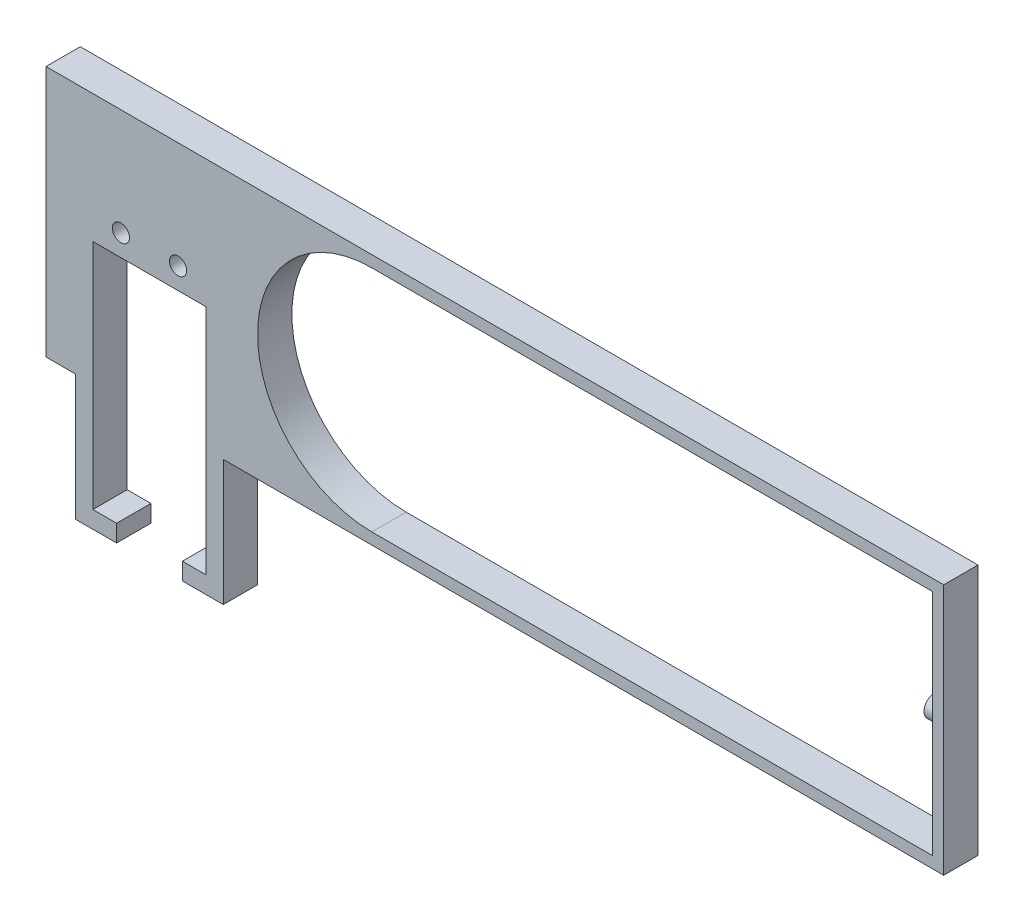
ISO-10303-21;
HEADER;
FILE_DESCRIPTION(('STEP AP214'),'2;1');
FILE_NAME('part.step','',(''),(''),'','','');
FILE_SCHEMA(('AUTOMOTIVE_DESIGN { 1 0 10303 214 1 1 1 1 }'));
ENDSEC;
DATA;
#1=APPLICATION_CONTEXT('core data for automotive mechanical design processes');
#2=APPLICATION_PROTOCOL_DEFINITION('international standard','automotive_design',2000,#1);
#3=PRODUCT_CONTEXT('',#1,'mechanical');
#4=PRODUCT('Part','Part','',(#3));
#5=PRODUCT_RELATED_PRODUCT_CATEGORY('part','',(#4));
#6=PRODUCT_DEFINITION_FORMATION('','',#4);
#7=PRODUCT_DEFINITION_CONTEXT('part definition',#1,'design');
#8=PRODUCT_DEFINITION('design','',#6,#7);
#9=PRODUCT_DEFINITION_SHAPE('','',#8);
#10=(LENGTH_UNIT() NAMED_UNIT(*) SI_UNIT(.MILLI.,.METRE.));
#11=(NAMED_UNIT(*) PLANE_ANGLE_UNIT() SI_UNIT($,.RADIAN.));
#12=(NAMED_UNIT(*) SI_UNIT($,.STERADIAN.) SOLID_ANGLE_UNIT());
#13=UNCERTAINTY_MEASURE_WITH_UNIT(LENGTH_MEASURE(1.E-05),#10,'distance_accuracy_value','');
#14=(GEOMETRIC_REPRESENTATION_CONTEXT(3) GLOBAL_UNCERTAINTY_ASSIGNED_CONTEXT((#13)) GLOBAL_UNIT_ASSIGNED_CONTEXT((#10,
#11,#12)) REPRESENTATION_CONTEXT('',''));
#15=CARTESIAN_POINT('',(0.,0.,0.));
#16=DIRECTION('',(0.,0.,1.));
#17=DIRECTION('',(1.,0.,0.));
#18=AXIS2_PLACEMENT_3D('',#15,#16,#17);
#19=CARTESIAN_POINT('',(0.,0.,6.));
#20=DIRECTION('',(0.,0.,1.));
#21=DIRECTION('',(1.,0.,0.));
#22=AXIS2_PLACEMENT_3D('',#19,#20,#21);
#23=PLANE('',#22);
#24=CARTESIAN_POINT('',(-43.9,25.353,6.));
#25=DIRECTION('',(0.,0.,1.));
#26=DIRECTION('',(1.,0.,0.));
#27=AXIS2_PLACEMENT_3D('',#24,#25,#26);
#28=CIRCLE('',#27,1.5);
#29=CARTESIAN_POINT('',(-42.4,25.353,6.));
#30=VERTEX_POINT('',#29);
#31=EDGE_CURVE('E215',#30,#30,#28,.T.);
#32=ORIENTED_EDGE('',*,*,#31,.F.);
#33=EDGE_LOOP('',(#32));
#34=FACE_BOUND('',#33,.T.);
#35=DIRECTION('',(1.,0.,0.));
#36=VECTOR('',#35,1.);
#37=CARTESIAN_POINT('',(0.,0.,6.));
#38=LINE('',#37,#36);
#39=CARTESIAN_POINT('',(-26.,0.,6.));
#40=VERTEX_POINT('',#39);
#41=CARTESIAN_POINT('',(100.,0.,6.));
#42=VERTEX_POINT('',#41);
#43=EDGE_CURVE('E221',#40,#42,#38,.T.);
#44=ORIENTED_EDGE('',*,*,#43,.T.);
#45=DIRECTION('',(0.,1.,0.));
#46=VECTOR('',#45,1.);
#47=CARTESIAN_POINT('',(100.,0.,6.));
#48=LINE('',#47,#46);
#49=CARTESIAN_POINT('',(100.,44.,6.));
#50=VERTEX_POINT('',#49);
#51=EDGE_CURVE('E223',#42,#50,#48,.T.);
#52=ORIENTED_EDGE('',*,*,#51,.T.);
#53=DIRECTION('',(-1.,0.,0.));
#54=VECTOR('',#53,1.);
#55=CARTESIAN_POINT('',(100.,44.,6.));
#56=LINE('',#55,#54);
#57=CARTESIAN_POINT('',(-57.,44.,6.));
#58=VERTEX_POINT('',#57);
#59=EDGE_CURVE('E226',#50,#58,#56,.T.);
#60=ORIENTED_EDGE('',*,*,#59,.T.);
#61=DIRECTION('',(0.,-1.,0.));
#62=VECTOR('',#61,1.);
#63=CARTESIAN_POINT('',(-57.,44.,6.));
#64=LINE('',#63,#62);
#65=CARTESIAN_POINT('',(-57.,0.,6.));
#66=VERTEX_POINT('',#65);
#67=EDGE_CURVE('E228',#58,#66,#64,.T.);
#68=ORIENTED_EDGE('',*,*,#67,.T.);
#69=DIRECTION('',(1.,0.,0.));
#70=VECTOR('',#69,1.);
#71=CARTESIAN_POINT('',(-57.,0.,6.));
#72=LINE('',#71,#70);
#73=CARTESIAN_POINT('',(-51.8,0.,6.));
#74=VERTEX_POINT('',#73);
#75=EDGE_CURVE('E230',#66,#74,#72,.T.);
#76=ORIENTED_EDGE('',*,*,#75,.T.);
#77=DIRECTION('',(0.,-1.,0.));
#78=VECTOR('',#77,1.);
#79=CARTESIAN_POINT('',(-51.8,0.,6.));
#80=LINE('',#79,#78);
#81=CARTESIAN_POINT('',(-51.8,-22.,6.));
#82=VERTEX_POINT('',#81);
#83=EDGE_CURVE('E232',#74,#82,#80,.T.);
#84=ORIENTED_EDGE('',*,*,#83,.T.);
#85=DIRECTION('',(1.,0.,0.));
#86=VECTOR('',#85,1.);
#87=CARTESIAN_POINT('',(-51.8,-22.,6.));
#88=LINE('',#87,#86);
#89=CARTESIAN_POINT('',(-44.65,-22.,6.));
#90=VERTEX_POINT('',#89);
#91=EDGE_CURVE('E234',#82,#90,#88,.T.);
#92=ORIENTED_EDGE('',*,*,#91,.T.);
#93=DIRECTION('',(0.,1.,0.));
#94=VECTOR('',#93,1.);
#95=CARTESIAN_POINT('',(-44.65,-22.,6.));
#96=LINE('',#95,#94);
#97=CARTESIAN_POINT('',(-44.65,-19.,6.));
#98=VERTEX_POINT('',#97);
#99=EDGE_CURVE('E236',#90,#98,#96,.T.);
#100=ORIENTED_EDGE('',*,*,#99,.T.);
#101=DIRECTION('',(-1.,0.,0.));
#102=VECTOR('',#101,1.);
#103=CARTESIAN_POINT('',(-44.65,-19.,6.));
#104=LINE('',#103,#102);
#105=CARTESIAN_POINT('',(-48.8,-19.,6.));
#106=VERTEX_POINT('',#105);
#107=EDGE_CURVE('E238',#98,#106,#104,.T.);
#108=ORIENTED_EDGE('',*,*,#107,.T.);
#109=DIRECTION('',(0.,1.,0.));
#110=VECTOR('',#109,1.);
#111=CARTESIAN_POINT('',(-48.8,-19.,6.));
#112=LINE('',#111,#110);
#113=CARTESIAN_POINT('',(-48.8,21.6,6.));
#114=VERTEX_POINT('',#113);
#115=EDGE_CURVE('E240',#106,#114,#112,.T.);
#116=ORIENTED_EDGE('',*,*,#115,.T.);
#117=DIRECTION('',(1.,0.,0.));
#118=VECTOR('',#117,1.);
#119=CARTESIAN_POINT('',(-48.8,21.6,6.));
#120=LINE('',#119,#118);
#121=CARTESIAN_POINT('',(-29.,21.6,6.));
#122=VERTEX_POINT('',#121);
#123=EDGE_CURVE('E242',#114,#122,#120,.T.);
#124=ORIENTED_EDGE('',*,*,#123,.T.);
#125=DIRECTION('',(0.,-1.,0.));
#126=VECTOR('',#125,1.);
#127=CARTESIAN_POINT('',(-29.,21.6,6.));
#128=LINE('',#127,#126);
#129=CARTESIAN_POINT('',(-29.,-19.,6.));
#130=VERTEX_POINT('',#129);
#131=EDGE_CURVE('E244',#122,#130,#128,.T.);
#132=ORIENTED_EDGE('',*,*,#131,.T.);
#133=DIRECTION('',(-1.,0.,0.));
#134=VECTOR('',#133,1.);
#135=CARTESIAN_POINT('',(-29.,-19.,6.));
#136=LINE('',#135,#134);
#137=CARTESIAN_POINT('',(-33.15,-19.,6.));
#138=VERTEX_POINT('',#137);
#139=EDGE_CURVE('E246',#130,#138,#136,.T.);
#140=ORIENTED_EDGE('',*,*,#139,.T.);
#141=DIRECTION('',(0.,-1.,0.));
#142=VECTOR('',#141,1.);
#143=CARTESIAN_POINT('',(-33.15,-19.,6.));
#144=LINE('',#143,#142);
#145=CARTESIAN_POINT('',(-33.15,-22.,6.));
#146=VERTEX_POINT('',#145);
#147=EDGE_CURVE('E248',#138,#146,#144,.T.);
#148=ORIENTED_EDGE('',*,*,#147,.T.);
#149=DIRECTION('',(1.,0.,0.));
#150=VECTOR('',#149,1.);
#151=CARTESIAN_POINT('',(-33.15,-22.,6.));
#152=LINE('',#151,#150);
#153=CARTESIAN_POINT('',(-26.,-22.,6.));
#154=VERTEX_POINT('',#153);
#155=EDGE_CURVE('E250',#146,#154,#152,.T.);
#156=ORIENTED_EDGE('',*,*,#155,.T.);
#157=DIRECTION('',(0.,1.,0.));
#158=VECTOR('',#157,1.);
#159=CARTESIAN_POINT('',(-26.,0.,6.));
#160=LINE('',#159,#158);
#161=EDGE_CURVE('E252',#154,#40,#160,.T.);
#162=ORIENTED_EDGE('',*,*,#161,.T.);
#163=EDGE_LOOP('',(#44,#52,#60,#68,#76,#84,#92,#100,#108,#116,#124,#132,#140,#148,#156,#162));
#164=FACE_BOUND('',#163,.T.);
#165=CARTESIAN_POINT('',(-33.9,25.353,6.));
#166=DIRECTION('',(0.,0.,1.));
#167=DIRECTION('',(1.,0.,0.));
#168=AXIS2_PLACEMENT_3D('',#165,#166,#167);
#169=CIRCLE('',#168,1.5);
#170=CARTESIAN_POINT('',(-32.4,25.353,6.));
#171=VERTEX_POINT('',#170);
#172=EDGE_CURVE('E209',#171,#171,#169,.T.);
#173=ORIENTED_EDGE('',*,*,#172,.F.);
#174=EDGE_LOOP('',(#173));
#175=FACE_BOUND('',#174,.T.);
#176=DIRECTION('',(1.,0.,0.));
#177=VECTOR('',#176,1.);
#178=CARTESIAN_POINT('',(0.,2.,6.));
#179=LINE('',#178,#177);
#180=CARTESIAN_POINT('',(0.,2.,6.));
#181=VERTEX_POINT('',#180);
#182=CARTESIAN_POINT('',(98.,2.00000000000001,6.));
#183=VERTEX_POINT('',#182);
#184=EDGE_CURVE('E179',#181,#183,#179,.T.);
#185=ORIENTED_EDGE('',*,*,#184,.F.);
#186=CARTESIAN_POINT('',(0.,22.,6.));
#187=DIRECTION('',(0.,0.,1.));
#188=DIRECTION('',(1.,0.,0.));
#189=AXIS2_PLACEMENT_3D('',#186,#187,#188);
#190=CIRCLE('',#189,20.);
#191=CARTESIAN_POINT('',(0.,42.,6.));
#192=VERTEX_POINT('',#191);
#193=EDGE_CURVE('E171',#192,#181,#190,.T.);
#194=ORIENTED_EDGE('',*,*,#193,.F.);
#195=DIRECTION('',(-1.,0.,0.));
#196=VECTOR('',#195,1.);
#197=CARTESIAN_POINT('',(98.,42.,6.));
#198=LINE('',#197,#196);
#199=CARTESIAN_POINT('',(98.,42.,6.));
#200=VERTEX_POINT('',#199);
#201=EDGE_CURVE('E193',#200,#192,#198,.T.);
#202=ORIENTED_EDGE('',*,*,#201,.F.);
#203=DIRECTION('',(0.,1.,0.));
#204=VECTOR('',#203,1.);
#205=CARTESIAN_POINT('',(98.,2.00000000000001,6.));
#206=LINE('',#205,#204);
#207=EDGE_CURVE('E191',#183,#200,#206,.T.);
#208=ORIENTED_EDGE('',*,*,#207,.F.);
#209=EDGE_LOOP('',(#185,#194,#202,#208));
#210=FACE_BOUND('',#209,.T.);
#211=ADVANCED_FACE('F34',(#34,#164,#175,#210),#23,.T.);
#212=CARTESIAN_POINT('',(0.,0.,0.));
#213=DIRECTION('',(0.,0.,1.));
#214=DIRECTION('',(1.,0.,0.));
#215=AXIS2_PLACEMENT_3D('',#212,#213,#214);
#216=PLANE('',#215);
#217=CARTESIAN_POINT('',(-33.9,25.353,0.));
#218=DIRECTION('',(0.,0.,1.));
#219=DIRECTION('',(1.,0.,0.));
#220=AXIS2_PLACEMENT_3D('',#217,#218,#219);
#221=CIRCLE('',#220,1.5);
#222=CARTESIAN_POINT('',(-32.4,25.353,0.));
#223=VERTEX_POINT('',#222);
#224=EDGE_CURVE('E187',#223,#223,#221,.T.);
#225=ORIENTED_EDGE('',*,*,#224,.T.);
#226=EDGE_LOOP('',(#225));
#227=FACE_BOUND('',#226,.T.);
#228=CARTESIAN_POINT('',(-43.9,25.353,0.));
#229=DIRECTION('',(0.,0.,1.));
#230=DIRECTION('',(1.,0.,0.));
#231=AXIS2_PLACEMENT_3D('',#228,#229,#230);
#232=CIRCLE('',#231,1.5);
#233=CARTESIAN_POINT('',(-42.4,25.353,0.));
#234=VERTEX_POINT('',#233);
#235=EDGE_CURVE('E212',#234,#234,#232,.T.);
#236=ORIENTED_EDGE('',*,*,#235,.T.);
#237=EDGE_LOOP('',(#236));
#238=FACE_BOUND('',#237,.T.);
#239=DIRECTION('',(1.,0.,0.));
#240=VECTOR('',#239,1.);
#241=CARTESIAN_POINT('',(0.,0.,0.));
#242=LINE('',#241,#240);
#243=CARTESIAN_POINT('',(-26.,0.,0.));
#244=VERTEX_POINT('',#243);
#245=CARTESIAN_POINT('',(100.,0.,0.));
#246=VERTEX_POINT('',#245);
#247=EDGE_CURVE('E218',#244,#246,#242,.T.);
#248=ORIENTED_EDGE('',*,*,#247,.F.);
#249=DIRECTION('',(0.,1.,0.));
#250=VECTOR('',#249,1.);
#251=CARTESIAN_POINT('',(-26.,0.,0.));
#252=LINE('',#251,#250);
#253=CARTESIAN_POINT('',(-26.,-22.,0.));
#254=VERTEX_POINT('',#253);
#255=EDGE_CURVE('E224',#254,#244,#252,.T.);
#256=ORIENTED_EDGE('',*,*,#255,.F.);
#257=DIRECTION('',(1.,0.,0.));
#258=VECTOR('',#257,1.);
#259=CARTESIAN_POINT('',(-33.15,-22.,0.));
#260=LINE('',#259,#258);
#261=CARTESIAN_POINT('',(-33.15,-22.,0.));
#262=VERTEX_POINT('',#261);
#263=EDGE_CURVE('E283',#262,#254,#260,.T.);
#264=ORIENTED_EDGE('',*,*,#263,.F.);
#265=DIRECTION('',(0.,-1.,0.));
#266=VECTOR('',#265,1.);
#267=CARTESIAN_POINT('',(-33.15,-19.,0.));
#268=LINE('',#267,#266);
#269=CARTESIAN_POINT('',(-33.15,-19.,0.));
#270=VERTEX_POINT('',#269);
#271=EDGE_CURVE('E281',#270,#262,#268,.T.);
#272=ORIENTED_EDGE('',*,*,#271,.F.);
#273=DIRECTION('',(-1.,0.,0.));
#274=VECTOR('',#273,1.);
#275=CARTESIAN_POINT('',(-29.,-19.,0.));
#276=LINE('',#275,#274);
#277=CARTESIAN_POINT('',(-29.,-19.,0.));
#278=VERTEX_POINT('',#277);
#279=EDGE_CURVE('E279',#278,#270,#276,.T.);
#280=ORIENTED_EDGE('',*,*,#279,.F.);
#281=DIRECTION('',(0.,-1.,0.));
#282=VECTOR('',#281,1.);
#283=CARTESIAN_POINT('',(-29.,21.6,0.));
#284=LINE('',#283,#282);
#285=CARTESIAN_POINT('',(-29.,21.6,0.));
#286=VERTEX_POINT('',#285);
#287=EDGE_CURVE('E277',#286,#278,#284,.T.);
#288=ORIENTED_EDGE('',*,*,#287,.F.);
#289=DIRECTION('',(1.,0.,0.));
#290=VECTOR('',#289,1.);
#291=CARTESIAN_POINT('',(-48.8,21.6,0.));
#292=LINE('',#291,#290);
#293=CARTESIAN_POINT('',(-48.8,21.6,0.));
#294=VERTEX_POINT('',#293);
#295=EDGE_CURVE('E275',#294,#286,#292,.T.);
#296=ORIENTED_EDGE('',*,*,#295,.F.);
#297=DIRECTION('',(0.,1.,0.));
#298=VECTOR('',#297,1.);
#299=CARTESIAN_POINT('',(-48.8,-19.,0.));
#300=LINE('',#299,#298);
#301=CARTESIAN_POINT('',(-48.8,-19.,0.));
#302=VERTEX_POINT('',#301);
#303=EDGE_CURVE('E273',#302,#294,#300,.T.);
#304=ORIENTED_EDGE('',*,*,#303,.F.);
#305=DIRECTION('',(-1.,0.,0.));
#306=VECTOR('',#305,1.);
#307=CARTESIAN_POINT('',(-44.65,-19.,0.));
#308=LINE('',#307,#306);
#309=CARTESIAN_POINT('',(-44.65,-19.,0.));
#310=VERTEX_POINT('',#309);
#311=EDGE_CURVE('E271',#310,#302,#308,.T.);
#312=ORIENTED_EDGE('',*,*,#311,.F.);
#313=DIRECTION('',(0.,1.,0.));
#314=VECTOR('',#313,1.);
#315=CARTESIAN_POINT('',(-44.65,-22.,0.));
#316=LINE('',#315,#314);
#317=CARTESIAN_POINT('',(-44.65,-22.,0.));
#318=VERTEX_POINT('',#317);
#319=EDGE_CURVE('E269',#318,#310,#316,.T.);
#320=ORIENTED_EDGE('',*,*,#319,.F.);
#321=DIRECTION('',(1.,0.,0.));
#322=VECTOR('',#321,1.);
#323=CARTESIAN_POINT('',(-51.8,-22.,0.));
#324=LINE('',#323,#322);
#325=CARTESIAN_POINT('',(-51.8,-22.,0.));
#326=VERTEX_POINT('',#325);
#327=EDGE_CURVE('E267',#326,#318,#324,.T.);
#328=ORIENTED_EDGE('',*,*,#327,.F.);
#329=DIRECTION('',(0.,-1.,0.));
#330=VECTOR('',#329,1.);
#331=CARTESIAN_POINT('',(-51.8,0.,0.));
#332=LINE('',#331,#330);
#333=CARTESIAN_POINT('',(-51.8,0.,0.));
#334=VERTEX_POINT('',#333);
#335=EDGE_CURVE('E265',#334,#326,#332,.T.);
#336=ORIENTED_EDGE('',*,*,#335,.F.);
#337=DIRECTION('',(1.,0.,0.));
#338=VECTOR('',#337,1.);
#339=CARTESIAN_POINT('',(-57.,0.,0.));
#340=LINE('',#339,#338);
#341=CARTESIAN_POINT('',(-57.,0.,0.));
#342=VERTEX_POINT('',#341);
#343=EDGE_CURVE('E263',#342,#334,#340,.T.);
#344=ORIENTED_EDGE('',*,*,#343,.F.);
#345=DIRECTION('',(0.,-1.,0.));
#346=VECTOR('',#345,1.);
#347=CARTESIAN_POINT('',(-57.,44.,0.));
#348=LINE('',#347,#346);
#349=CARTESIAN_POINT('',(-57.,44.,0.));
#350=VERTEX_POINT('',#349);
#351=EDGE_CURVE('E261',#350,#342,#348,.T.);
#352=ORIENTED_EDGE('',*,*,#351,.F.);
#353=DIRECTION('',(-1.,0.,0.));
#354=VECTOR('',#353,1.);
#355=CARTESIAN_POINT('',(0.,44.,0.));
#356=LINE('',#355,#354);
#357=CARTESIAN_POINT('',(100.,44.,0.));
#358=VERTEX_POINT('',#357);
#359=EDGE_CURVE('E259',#358,#350,#356,.T.);
#360=ORIENTED_EDGE('',*,*,#359,.F.);
#361=DIRECTION('',(0.,1.,0.));
#362=VECTOR('',#361,1.);
#363=CARTESIAN_POINT('',(100.,0.,0.));
#364=LINE('',#363,#362);
#365=EDGE_CURVE('E256',#246,#358,#364,.T.);
#366=ORIENTED_EDGE('',*,*,#365,.F.);
#367=EDGE_LOOP('',(#248,#256,#264,#272,#280,#288,#296,#304,#312,#320,#328,#336,#344,#352,#360,#366));
#368=FACE_BOUND('',#367,.T.);
#369=CARTESIAN_POINT('',(0.,22.,0.));
#370=DIRECTION('',(0.,0.,1.));
#371=DIRECTION('',(1.,0.,0.));
#372=AXIS2_PLACEMENT_3D('',#369,#370,#371);
#373=CIRCLE('',#372,20.);
#374=CARTESIAN_POINT('',(0.,42.,0.));
#375=VERTEX_POINT('',#374);
#376=CARTESIAN_POINT('',(0.,2.,0.));
#377=VERTEX_POINT('',#376);
#378=EDGE_CURVE('E57',#375,#377,#373,.T.);
#379=ORIENTED_EDGE('',*,*,#378,.T.);
#380=DIRECTION('',(1.,0.,0.));
#381=VECTOR('',#380,1.);
#382=CARTESIAN_POINT('',(0.,2.,0.));
#383=LINE('',#382,#381);
#384=CARTESIAN_POINT('',(98.,2.00000000000001,0.));
#385=VERTEX_POINT('',#384);
#386=EDGE_CURVE('E186',#377,#385,#383,.T.);
#387=ORIENTED_EDGE('',*,*,#386,.T.);
#388=DIRECTION('',(0.,1.,0.));
#389=VECTOR('',#388,1.);
#390=CARTESIAN_POINT('',(98.,2.00000000000001,0.));
#391=LINE('',#390,#389);
#392=CARTESIAN_POINT('',(98.,42.,0.));
#393=VERTEX_POINT('',#392);
#394=EDGE_CURVE('E201',#385,#393,#391,.T.);
#395=ORIENTED_EDGE('',*,*,#394,.T.);
#396=DIRECTION('',(-1.,0.,0.));
#397=VECTOR('',#396,1.);
#398=CARTESIAN_POINT('',(98.,42.,0.));
#399=LINE('',#398,#397);
#400=EDGE_CURVE('E180',#393,#375,#399,.T.);
#401=ORIENTED_EDGE('',*,*,#400,.T.);
#402=EDGE_LOOP('',(#379,#387,#395,#401));
#403=FACE_BOUND('',#402,.T.);
#404=ADVANCED_FACE('F339',(#227,#238,#368,#403),#216,.F.);
#405=CARTESIAN_POINT('',(0.,0.,6.));
#406=DIRECTION('',(0.,1.,0.));
#407=DIRECTION('',(0.,0.,1.));
#408=AXIS2_PLACEMENT_3D('',#405,#406,#407);
#409=PLANE('',#408);
#410=ORIENTED_EDGE('',*,*,#247,.T.);
#411=DIRECTION('',(0.,0.,-1.));
#412=VECTOR('',#411,1.);
#413=CARTESIAN_POINT('',(100.,0.,6.));
#414=LINE('',#413,#412);
#415=EDGE_CURVE('E11',#42,#246,#414,.T.);
#416=ORIENTED_EDGE('',*,*,#415,.F.);
#417=ORIENTED_EDGE('',*,*,#43,.F.);
#418=DIRECTION('',(0.,0.,-1.));
#419=VECTOR('',#418,1.);
#420=CARTESIAN_POINT('',(-26.,0.,6.));
#421=LINE('',#420,#419);
#422=EDGE_CURVE('E254',#40,#244,#421,.T.);
#423=ORIENTED_EDGE('',*,*,#422,.T.);
#424=EDGE_LOOP('',(#410,#416,#417,#423));
#425=FACE_BOUND('',#424,.T.);
#426=ADVANCED_FACE('F36',(#425),#409,.F.);
#427=CARTESIAN_POINT('',(100.,0.,6.));
#428=DIRECTION('',(-1.,0.,0.));
#429=DIRECTION('',(0.,0.,1.));
#430=AXIS2_PLACEMENT_3D('',#427,#428,#429);
#431=PLANE('',#430);
#432=ORIENTED_EDGE('',*,*,#365,.T.);
#433=DIRECTION('',(0.,0.,-1.));
#434=VECTOR('',#433,1.);
#435=CARTESIAN_POINT('',(100.,44.,6.));
#436=LINE('',#435,#434);
#437=EDGE_CURVE('E42',#50,#358,#436,.T.);
#438=ORIENTED_EDGE('',*,*,#437,.F.);
#439=ORIENTED_EDGE('',*,*,#51,.F.);
#440=ORIENTED_EDGE('',*,*,#415,.T.);
#441=EDGE_LOOP('',(#432,#438,#439,#440));
#442=FACE_BOUND('',#441,.T.);
#443=ADVANCED_FACE('F335',(#442),#431,.F.);
#444=CARTESIAN_POINT('',(0.,44.,6.));
#445=DIRECTION('',(0.,-1.,0.));
#446=DIRECTION('',(0.,0.,-1.));
#447=AXIS2_PLACEMENT_3D('',#444,#445,#446);
#448=PLANE('',#447);
#449=ORIENTED_EDGE('',*,*,#359,.T.);
#450=DIRECTION('',(0.,0.,-1.));
#451=VECTOR('',#450,1.);
#452=CARTESIAN_POINT('',(-57.,44.,6.));
#453=LINE('',#452,#451);
#454=EDGE_CURVE('E325',#58,#350,#453,.T.);
#455=ORIENTED_EDGE('',*,*,#454,.F.);
#456=ORIENTED_EDGE('',*,*,#59,.F.);
#457=ORIENTED_EDGE('',*,*,#437,.T.);
#458=EDGE_LOOP('',(#449,#455,#456,#457));
#459=FACE_BOUND('',#458,.T.);
#460=ADVANCED_FACE('F331',(#459),#448,.F.);
#461=CARTESIAN_POINT('',(-57.,44.,6.));
#462=DIRECTION('',(1.,0.,0.));
#463=DIRECTION('',(0.,1.,0.));
#464=AXIS2_PLACEMENT_3D('',#461,#462,#463);
#465=PLANE('',#464);
#466=ORIENTED_EDGE('',*,*,#351,.T.);
#467=DIRECTION('',(0.,0.,-1.));
#468=VECTOR('',#467,1.);
#469=CARTESIAN_POINT('',(-57.,0.,6.));
#470=LINE('',#469,#468);
#471=EDGE_CURVE('E322',#66,#342,#470,.T.);
#472=ORIENTED_EDGE('',*,*,#471,.F.);
#473=ORIENTED_EDGE('',*,*,#67,.F.);
#474=ORIENTED_EDGE('',*,*,#454,.T.);
#475=EDGE_LOOP('',(#466,#472,#473,#474));
#476=FACE_BOUND('',#475,.T.);
#477=ADVANCED_FACE('F347',(#476),#465,.F.);
#478=CARTESIAN_POINT('',(-57.,0.,6.));
#479=DIRECTION('',(0.,1.,0.));
#480=DIRECTION('',(-1.,0.,0.));
#481=AXIS2_PLACEMENT_3D('',#478,#479,#480);
#482=PLANE('',#481);
#483=ORIENTED_EDGE('',*,*,#343,.T.);
#484=DIRECTION('',(0.,0.,-1.));
#485=VECTOR('',#484,1.);
#486=CARTESIAN_POINT('',(-51.8,0.,6.));
#487=LINE('',#486,#485);
#488=EDGE_CURVE('E319',#74,#334,#487,.T.);
#489=ORIENTED_EDGE('',*,*,#488,.F.);
#490=ORIENTED_EDGE('',*,*,#75,.F.);
#491=ORIENTED_EDGE('',*,*,#471,.T.);
#492=EDGE_LOOP('',(#483,#489,#490,#491));
#493=FACE_BOUND('',#492,.T.);
#494=ADVANCED_FACE('F351',(#493),#482,.F.);
#495=CARTESIAN_POINT('',(-51.8,0.,6.));
#496=DIRECTION('',(1.,0.,0.));
#497=DIRECTION('',(0.,0.,-1.));
#498=AXIS2_PLACEMENT_3D('',#495,#496,#497);
#499=PLANE('',#498);
#500=ORIENTED_EDGE('',*,*,#335,.T.);
#501=DIRECTION('',(0.,0.,-1.));
#502=VECTOR('',#501,1.);
#503=CARTESIAN_POINT('',(-51.8,-22.,6.));
#504=LINE('',#503,#502);
#505=EDGE_CURVE('E316',#82,#326,#504,.T.);
#506=ORIENTED_EDGE('',*,*,#505,.F.);
#507=ORIENTED_EDGE('',*,*,#83,.F.);
#508=ORIENTED_EDGE('',*,*,#488,.T.);
#509=EDGE_LOOP('',(#500,#506,#507,#508));
#510=FACE_BOUND('',#509,.T.);
#511=ADVANCED_FACE('F409',(#510),#499,.F.);
#512=CARTESIAN_POINT('',(-51.8,-22.,6.));
#513=DIRECTION('',(0.,1.,0.));
#514=DIRECTION('',(-1.,0.,0.));
#515=AXIS2_PLACEMENT_3D('',#512,#513,#514);
#516=PLANE('',#515);
#517=ORIENTED_EDGE('',*,*,#327,.T.);
#518=DIRECTION('',(0.,0.,-1.));
#519=VECTOR('',#518,1.);
#520=CARTESIAN_POINT('',(-44.65,-22.,6.));
#521=LINE('',#520,#519);
#522=EDGE_CURVE('E313',#90,#318,#521,.T.);
#523=ORIENTED_EDGE('',*,*,#522,.F.);
#524=ORIENTED_EDGE('',*,*,#91,.F.);
#525=ORIENTED_EDGE('',*,*,#505,.T.);
#526=EDGE_LOOP('',(#517,#523,#524,#525));
#527=FACE_BOUND('',#526,.T.);
#528=ADVANCED_FACE('F407',(#527),#516,.F.);
#529=CARTESIAN_POINT('',(-44.65,-22.,6.));
#530=DIRECTION('',(-1.,0.,0.));
#531=DIRECTION('',(0.,-1.,0.));
#532=AXIS2_PLACEMENT_3D('',#529,#530,#531);
#533=PLANE('',#532);
#534=ORIENTED_EDGE('',*,*,#319,.T.);
#535=DIRECTION('',(0.,0.,-1.));
#536=VECTOR('',#535,1.);
#537=CARTESIAN_POINT('',(-44.65,-19.,6.));
#538=LINE('',#537,#536);
#539=EDGE_CURVE('E310',#98,#310,#538,.T.);
#540=ORIENTED_EDGE('',*,*,#539,.F.);
#541=ORIENTED_EDGE('',*,*,#99,.F.);
#542=ORIENTED_EDGE('',*,*,#522,.T.);
#543=EDGE_LOOP('',(#534,#540,#541,#542));
#544=FACE_BOUND('',#543,.T.);
#545=ADVANCED_FACE('F403',(#544),#533,.F.);
#546=CARTESIAN_POINT('',(-44.65,-19.,6.));
#547=DIRECTION('',(0.,-1.,0.));
#548=DIRECTION('',(1.,0.,0.));
#549=AXIS2_PLACEMENT_3D('',#546,#547,#548);
#550=PLANE('',#549);
#551=ORIENTED_EDGE('',*,*,#311,.T.);
#552=DIRECTION('',(0.,0.,-1.));
#553=VECTOR('',#552,1.);
#554=CARTESIAN_POINT('',(-48.8,-19.,6.));
#555=LINE('',#554,#553);
#556=EDGE_CURVE('E307',#106,#302,#555,.T.);
#557=ORIENTED_EDGE('',*,*,#556,.F.);
#558=ORIENTED_EDGE('',*,*,#107,.F.);
#559=ORIENTED_EDGE('',*,*,#539,.T.);
#560=EDGE_LOOP('',(#551,#557,#558,#559));
#561=FACE_BOUND('',#560,.T.);
#562=ADVANCED_FACE('F398',(#561),#550,.F.);
#563=CARTESIAN_POINT('',(-48.8,-19.,6.));
#564=DIRECTION('',(-1.,0.,0.));
#565=DIRECTION('',(0.,-1.,0.));
#566=AXIS2_PLACEMENT_3D('',#563,#564,#565);
#567=PLANE('',#566);
#568=ORIENTED_EDGE('',*,*,#303,.T.);
#569=DIRECTION('',(0.,0.,-1.));
#570=VECTOR('',#569,1.);
#571=CARTESIAN_POINT('',(-48.8,21.6,6.));
#572=LINE('',#571,#570);
#573=EDGE_CURVE('E304',#114,#294,#572,.T.);
#574=ORIENTED_EDGE('',*,*,#573,.F.);
#575=ORIENTED_EDGE('',*,*,#115,.F.);
#576=ORIENTED_EDGE('',*,*,#556,.T.);
#577=EDGE_LOOP('',(#568,#574,#575,#576));
#578=FACE_BOUND('',#577,.T.);
#579=ADVANCED_FACE('F392',(#578),#567,.F.);
#580=CARTESIAN_POINT('',(-48.8,21.6,6.));
#581=DIRECTION('',(0.,1.,0.));
#582=DIRECTION('',(0.,0.,1.));
#583=AXIS2_PLACEMENT_3D('',#580,#581,#582);
#584=PLANE('',#583);
#585=ORIENTED_EDGE('',*,*,#295,.T.);
#586=DIRECTION('',(0.,0.,-1.));
#587=VECTOR('',#586,1.);
#588=CARTESIAN_POINT('',(-29.,21.6,6.));
#589=LINE('',#588,#587);
#590=EDGE_CURVE('E301',#122,#286,#589,.T.);
#591=ORIENTED_EDGE('',*,*,#590,.F.);
#592=ORIENTED_EDGE('',*,*,#123,.F.);
#593=ORIENTED_EDGE('',*,*,#573,.T.);
#594=EDGE_LOOP('',(#585,#591,#592,#593));
#595=FACE_BOUND('',#594,.T.);
#596=ADVANCED_FACE('F388',(#595),#584,.F.);
#597=CARTESIAN_POINT('',(-29.,21.6,6.));
#598=DIRECTION('',(1.,0.,0.));
#599=DIRECTION('',(0.,1.,0.));
#600=AXIS2_PLACEMENT_3D('',#597,#598,#599);
#601=PLANE('',#600);
#602=ORIENTED_EDGE('',*,*,#287,.T.);
#603=DIRECTION('',(0.,0.,-1.));
#604=VECTOR('',#603,1.);
#605=CARTESIAN_POINT('',(-29.,-19.,6.));
#606=LINE('',#605,#604);
#607=EDGE_CURVE('E298',#130,#278,#606,.T.);
#608=ORIENTED_EDGE('',*,*,#607,.F.);
#609=ORIENTED_EDGE('',*,*,#131,.F.);
#610=ORIENTED_EDGE('',*,*,#590,.T.);
#611=EDGE_LOOP('',(#602,#608,#609,#610));
#612=FACE_BOUND('',#611,.T.);
#613=ADVANCED_FACE('F383',(#612),#601,.F.);
#614=CARTESIAN_POINT('',(-29.,-19.,6.));
#615=DIRECTION('',(0.,-1.,0.));
#616=DIRECTION('',(1.,0.,0.));
#617=AXIS2_PLACEMENT_3D('',#614,#615,#616);
#618=PLANE('',#617);
#619=ORIENTED_EDGE('',*,*,#279,.T.);
#620=DIRECTION('',(0.,0.,-1.));
#621=VECTOR('',#620,1.);
#622=CARTESIAN_POINT('',(-33.15,-19.,6.));
#623=LINE('',#622,#621);
#624=EDGE_CURVE('E295',#138,#270,#623,.T.);
#625=ORIENTED_EDGE('',*,*,#624,.F.);
#626=ORIENTED_EDGE('',*,*,#139,.F.);
#627=ORIENTED_EDGE('',*,*,#607,.T.);
#628=EDGE_LOOP('',(#619,#625,#626,#627));
#629=FACE_BOUND('',#628,.T.);
#630=ADVANCED_FACE('F377',(#629),#618,.F.);
#631=CARTESIAN_POINT('',(-33.15,-19.,6.));
#632=DIRECTION('',(1.,0.,0.));
#633=DIRECTION('',(0.,0.,-1.));
#634=AXIS2_PLACEMENT_3D('',#631,#632,#633);
#635=PLANE('',#634);
#636=ORIENTED_EDGE('',*,*,#271,.T.);
#637=DIRECTION('',(0.,0.,-1.));
#638=VECTOR('',#637,1.);
#639=CARTESIAN_POINT('',(-33.15,-22.,6.));
#640=LINE('',#639,#638);
#641=EDGE_CURVE('E292',#146,#262,#640,.T.);
#642=ORIENTED_EDGE('',*,*,#641,.F.);
#643=ORIENTED_EDGE('',*,*,#147,.F.);
#644=ORIENTED_EDGE('',*,*,#624,.T.);
#645=EDGE_LOOP('',(#636,#642,#643,#644));
#646=FACE_BOUND('',#645,.T.);
#647=ADVANCED_FACE('F373',(#646),#635,.F.);
#648=CARTESIAN_POINT('',(-33.15,-22.,6.));
#649=DIRECTION('',(0.,1.,0.));
#650=DIRECTION('',(0.,0.,1.));
#651=AXIS2_PLACEMENT_3D('',#648,#649,#650);
#652=PLANE('',#651);
#653=ORIENTED_EDGE('',*,*,#263,.T.);
#654=DIRECTION('',(0.,0.,-1.));
#655=VECTOR('',#654,1.);
#656=CARTESIAN_POINT('',(-26.,-22.,6.));
#657=LINE('',#656,#655);
#658=EDGE_CURVE('E289',#154,#254,#657,.T.);
#659=ORIENTED_EDGE('',*,*,#658,.F.);
#660=ORIENTED_EDGE('',*,*,#155,.F.);
#661=ORIENTED_EDGE('',*,*,#641,.T.);
#662=EDGE_LOOP('',(#653,#659,#660,#661));
#663=FACE_BOUND('',#662,.T.);
#664=ADVANCED_FACE('F368',(#663),#652,.F.);
#665=CARTESIAN_POINT('',(-26.,0.,6.));
#666=DIRECTION('',(-1.,0.,0.));
#667=DIRECTION('',(0.,-1.,0.));
#668=AXIS2_PLACEMENT_3D('',#665,#666,#667);
#669=PLANE('',#668);
#670=ORIENTED_EDGE('',*,*,#255,.T.);
#671=ORIENTED_EDGE('',*,*,#422,.F.);
#672=ORIENTED_EDGE('',*,*,#161,.F.);
#673=ORIENTED_EDGE('',*,*,#658,.T.);
#674=EDGE_LOOP('',(#670,#671,#672,#673));
#675=FACE_BOUND('',#674,.T.);
#676=ADVANCED_FACE('F362',(#675),#669,.F.);
#677=CARTESIAN_POINT('',(-43.9,25.353,6.));
#678=DIRECTION('',(0.,0.,-1.));
#679=DIRECTION('',(-1.,0.,0.));
#680=AXIS2_PLACEMENT_3D('',#677,#678,#679);
#681=CYLINDRICAL_SURFACE('',#680,1.5);
#682=ORIENTED_EDGE('',*,*,#31,.T.);
#683=EDGE_LOOP('',(#682));
#684=FACE_BOUND('',#683,.T.);
#685=ORIENTED_EDGE('',*,*,#235,.F.);
#686=EDGE_LOOP('',(#685));
#687=FACE_BOUND('',#686,.T.);
#688=ADVANCED_FACE('F428',(#684,#687),#681,.F.);
#689=CARTESIAN_POINT('',(-33.9,25.353,6.));
#690=DIRECTION('',(0.,0.,-1.));
#691=DIRECTION('',(-1.,0.,0.));
#692=AXIS2_PLACEMENT_3D('',#689,#690,#691);
#693=CYLINDRICAL_SURFACE('',#692,1.5);
#694=ORIENTED_EDGE('',*,*,#172,.T.);
#695=EDGE_LOOP('',(#694));
#696=FACE_BOUND('',#695,.T.);
#697=ORIENTED_EDGE('',*,*,#224,.F.);
#698=EDGE_LOOP('',(#697));
#699=FACE_BOUND('',#698,.T.);
#700=ADVANCED_FACE('F490',(#696,#699),#693,.F.);
#701=CARTESIAN_POINT('',(0.,22.,6.));
#702=DIRECTION('',(0.,0.,-1.));
#703=DIRECTION('',(-1.,0.,0.));
#704=AXIS2_PLACEMENT_3D('',#701,#702,#703);
#705=CYLINDRICAL_SURFACE('',#704,20.);
#706=ORIENTED_EDGE('',*,*,#378,.F.);
#707=DIRECTION('',(0.,0.,-1.));
#708=VECTOR('',#707,1.);
#709=CARTESIAN_POINT('',(0.,42.,6.));
#710=LINE('',#709,#708);
#711=EDGE_CURVE('E175',#192,#375,#710,.T.);
#712=ORIENTED_EDGE('',*,*,#711,.F.);
#713=ORIENTED_EDGE('',*,*,#193,.T.);
#714=DIRECTION('',(0.,0.,-1.));
#715=VECTOR('',#714,1.);
#716=CARTESIAN_POINT('',(0.,2.,6.));
#717=LINE('',#716,#715);
#718=EDGE_CURVE('E174',#181,#377,#717,.T.);
#719=ORIENTED_EDGE('',*,*,#718,.T.);
#720=EDGE_LOOP('',(#706,#712,#713,#719));
#721=FACE_BOUND('',#720,.T.);
#722=ADVANCED_FACE('F173',(#721),#705,.F.);
#723=CARTESIAN_POINT('',(0.,2.,6.));
#724=DIRECTION('',(0.,1.,0.));
#725=DIRECTION('',(-1.,0.,0.));
#726=AXIS2_PLACEMENT_3D('',#723,#724,#725);
#727=PLANE('',#726);
#728=ORIENTED_EDGE('',*,*,#386,.F.);
#729=ORIENTED_EDGE('',*,*,#718,.F.);
#730=ORIENTED_EDGE('',*,*,#184,.T.);
#731=DIRECTION('',(0.,0.,-1.));
#732=VECTOR('',#731,1.);
#733=CARTESIAN_POINT('',(98.,2.00000000000001,6.));
#734=LINE('',#733,#732);
#735=EDGE_CURVE('E188',#183,#385,#734,.T.);
#736=ORIENTED_EDGE('',*,*,#735,.T.);
#737=EDGE_LOOP('',(#728,#729,#730,#736));
#738=FACE_BOUND('',#737,.T.);
#739=ADVANCED_FACE('F183',(#738),#727,.T.);
#740=CARTESIAN_POINT('',(98.,2.00000000000001,6.));
#741=DIRECTION('',(-1.,0.,0.));
#742=DIRECTION('',(0.,0.,1.));
#743=AXIS2_PLACEMENT_3D('',#740,#741,#742);
#744=PLANE('',#743);
#745=CARTESIAN_POINT('',(98.,22.,3.));
#746=DIRECTION('',(-1.,0.,0.));
#747=DIRECTION('',(0.,0.,1.));
#748=AXIS2_PLACEMENT_3D('',#745,#746,#747);
#749=CIRCLE('',#748,1.905);
#750=CARTESIAN_POINT('',(98.,22.,4.905));
#751=VERTEX_POINT('',#750);
#752=EDGE_CURVE('E638',#751,#751,#749,.T.);
#753=ORIENTED_EDGE('',*,*,#752,.F.);
#754=EDGE_LOOP('',(#753));
#755=FACE_BOUND('',#754,.T.);
#756=ORIENTED_EDGE('',*,*,#394,.F.);
#757=ORIENTED_EDGE('',*,*,#735,.F.);
#758=ORIENTED_EDGE('',*,*,#207,.T.);
#759=DIRECTION('',(0.,0.,-1.));
#760=VECTOR('',#759,1.);
#761=CARTESIAN_POINT('',(98.,42.,6.));
#762=LINE('',#761,#760);
#763=EDGE_CURVE('E49',#200,#393,#762,.T.);
#764=ORIENTED_EDGE('',*,*,#763,.T.);
#765=EDGE_LOOP('',(#756,#757,#758,#764));
#766=FACE_BOUND('',#765,.T.);
#767=ADVANCED_FACE('F509',(#755,#766),#744,.T.);
#768=CARTESIAN_POINT('',(98.,42.,6.));
#769=DIRECTION('',(0.,-1.,0.));
#770=DIRECTION('',(1.,0.,0.));
#771=AXIS2_PLACEMENT_3D('',#768,#769,#770);
#772=PLANE('',#771);
#773=ORIENTED_EDGE('',*,*,#400,.F.);
#774=ORIENTED_EDGE('',*,*,#763,.F.);
#775=ORIENTED_EDGE('',*,*,#201,.T.);
#776=ORIENTED_EDGE('',*,*,#711,.T.);
#777=EDGE_LOOP('',(#773,#774,#775,#776));
#778=FACE_BOUND('',#777,.T.);
#779=ADVANCED_FACE('F517',(#778),#772,.T.);
#780=CARTESIAN_POINT('',(95.46,22.,3.));
#781=DIRECTION('',(1.,0.,0.));
#782=DIRECTION('',(0.,0.,-1.));
#783=AXIS2_PLACEMENT_3D('',#780,#781,#782);
#784=CYLINDRICAL_SURFACE('',#783,1.905);
#785=CARTESIAN_POINT('',(95.46,22.,3.));
#786=DIRECTION('',(-1.,0.,0.));
#787=DIRECTION('',(0.,0.,1.));
#788=AXIS2_PLACEMENT_3D('',#785,#786,#787);
#789=CIRCLE('',#788,1.905);
#790=CARTESIAN_POINT('',(95.46,22.,4.905));
#791=VERTEX_POINT('',#790);
#792=EDGE_CURVE('E199',#791,#791,#789,.T.);
#793=ORIENTED_EDGE('',*,*,#792,.F.);
#794=EDGE_LOOP('',(#793));
#795=FACE_BOUND('',#794,.T.);
#796=ORIENTED_EDGE('',*,*,#752,.T.);
#797=EDGE_LOOP('',(#796));
#798=FACE_BOUND('',#797,.T.);
#799=ADVANCED_FACE('F525',(#795,#798),#784,.T.);
#800=CARTESIAN_POINT('',(95.46,22.,3.));
#801=DIRECTION('',(-1.,0.,0.));
#802=DIRECTION('',(0.,0.,1.));
#803=AXIS2_PLACEMENT_3D('',#800,#801,#802);
#804=PLANE('',#803);
#805=ORIENTED_EDGE('',*,*,#792,.T.);
#806=EDGE_LOOP('',(#805));
#807=FACE_BOUND('',#806,.T.);
#808=ADVANCED_FACE('F531',(#807),#804,.T.);
#809=CLOSED_SHELL('',(#211,#404,#426,#443,#460,#477,#494,#511,#528,#545,#562,#579,#596,#613,
#630,#647,#664,#676,#688,#700,#722,#739,#767,#779,#799,#808));
#810=MANIFOLD_SOLID_BREP('B2',#809);
#811=ADVANCED_BREP_SHAPE_REPRESENTATION('',(#18,#810),#14);
#812=SHAPE_DEFINITION_REPRESENTATION(#9,#811);
ENDSEC;
END-ISO-10303-21;
